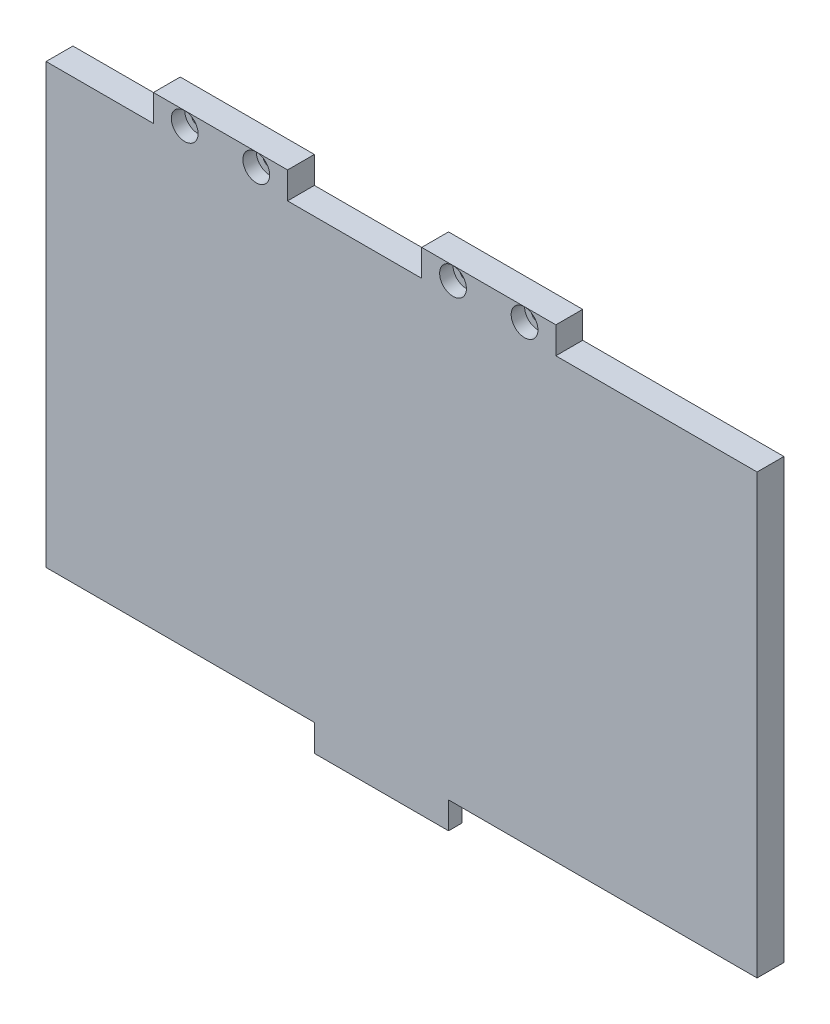
ISO-10303-21;
HEADER;
FILE_DESCRIPTION(('STEP AP214'),'2;1');
FILE_NAME('part.step','',(''),(''),'','','');
FILE_SCHEMA(('AUTOMOTIVE_DESIGN { 1 0 10303 214 1 1 1 1 }'));
ENDSEC;
DATA;
#1=APPLICATION_CONTEXT('core data for automotive mechanical design processes');
#2=APPLICATION_PROTOCOL_DEFINITION('international standard','automotive_design',2000,#1);
#3=PRODUCT_CONTEXT('',#1,'mechanical');
#4=PRODUCT('Part','Part','',(#3));
#5=PRODUCT_RELATED_PRODUCT_CATEGORY('part','',(#4));
#6=PRODUCT_DEFINITION_FORMATION('','',#4);
#7=PRODUCT_DEFINITION_CONTEXT('part definition',#1,'design');
#8=PRODUCT_DEFINITION('design','',#6,#7);
#9=PRODUCT_DEFINITION_SHAPE('','',#8);
#10=(LENGTH_UNIT() NAMED_UNIT(*) SI_UNIT(.MILLI.,.METRE.));
#11=(NAMED_UNIT(*) PLANE_ANGLE_UNIT() SI_UNIT($,.RADIAN.));
#12=(NAMED_UNIT(*) SI_UNIT($,.STERADIAN.) SOLID_ANGLE_UNIT());
#13=UNCERTAINTY_MEASURE_WITH_UNIT(LENGTH_MEASURE(1.E-05),#10,'distance_accuracy_value','');
#14=(GEOMETRIC_REPRESENTATION_CONTEXT(3) GLOBAL_UNCERTAINTY_ASSIGNED_CONTEXT((#13)) GLOBAL_UNIT_ASSIGNED_CONTEXT((#10,
#11,#12)) REPRESENTATION_CONTEXT('',''));
#15=CARTESIAN_POINT('',(0.,0.,0.));
#16=DIRECTION('',(0.,0.,1.));
#17=DIRECTION('',(1.,0.,0.));
#18=AXIS2_PLACEMENT_3D('',#15,#16,#17);
#19=CARTESIAN_POINT('',(-99.,-6.00000000000001,6.));
#20=DIRECTION('',(1.,0.,0.));
#21=DIRECTION('',(0.,1.,0.));
#22=AXIS2_PLACEMENT_3D('',#19,#20,#21);
#23=PLANE('',#22);
#24=DIRECTION('',(0.,1.,0.));
#25=VECTOR('',#24,1.);
#26=CARTESIAN_POINT('',(-99.,0.,3.));
#27=LINE('',#26,#25);
#28=CARTESIAN_POINT('',(-99.,-6.00000000000001,3.));
#29=VERTEX_POINT('',#28);
#30=CARTESIAN_POINT('',(-99.,0.,3.));
#31=VERTEX_POINT('',#30);
#32=EDGE_CURVE('E151',#29,#31,#27,.T.);
#33=ORIENTED_EDGE('',*,*,#32,.F.);
#34=DIRECTION('',(0.,0.,-1.));
#35=VECTOR('',#34,1.);
#36=CARTESIAN_POINT('',(-99.,-6.00000000000001,6.));
#37=LINE('',#36,#35);
#38=CARTESIAN_POINT('',(-99.,-6.00000000000001,6.));
#39=VERTEX_POINT('',#38);
#40=EDGE_CURVE('E159',#39,#29,#37,.T.);
#41=ORIENTED_EDGE('',*,*,#40,.F.);
#42=DIRECTION('',(0.,1.,0.));
#43=VECTOR('',#42,1.);
#44=CARTESIAN_POINT('',(-99.,-6.00000000000001,6.));
#45=LINE('',#44,#43);
#46=CARTESIAN_POINT('',(-98.9999999999999,0.,6.));
#47=VERTEX_POINT('',#46);
#48=EDGE_CURVE('E172',#39,#47,#45,.T.);
#49=ORIENTED_EDGE('',*,*,#48,.T.);
#50=DIRECTION('',(0.,0.,-1.));
#51=VECTOR('',#50,1.);
#52=CARTESIAN_POINT('',(-99.,0.,6.));
#53=LINE('',#52,#51);
#54=EDGE_CURVE('E59',#47,#31,#53,.T.);
#55=ORIENTED_EDGE('',*,*,#54,.T.);
#56=EDGE_LOOP('',(#33,#41,#49,#55));
#57=FACE_BOUND('',#56,.T.);
#58=ADVANCED_FACE('F33',(#57),#23,.F.);
#59=CARTESIAN_POINT('',(-69.,-6.00000000000001,6.));
#60=DIRECTION('',(-1.,0.,0.));
#61=DIRECTION('',(0.,-1.,0.));
#62=AXIS2_PLACEMENT_3D('',#59,#60,#61);
#63=PLANE('',#62);
#64=DIRECTION('',(0.,-1.,0.));
#65=VECTOR('',#64,1.);
#66=CARTESIAN_POINT('',(-68.9999999999999,0.,3.));
#67=LINE('',#66,#65);
#68=CARTESIAN_POINT('',(-68.9999999999999,0.,3.));
#69=VERTEX_POINT('',#68);
#70=CARTESIAN_POINT('',(-69.,-6.00000000000001,3.));
#71=VERTEX_POINT('',#70);
#72=EDGE_CURVE('E51',#69,#71,#67,.T.);
#73=ORIENTED_EDGE('',*,*,#72,.F.);
#74=DIRECTION('',(0.,0.,1.));
#75=VECTOR('',#74,1.);
#76=CARTESIAN_POINT('',(-69.,0.,6.));
#77=LINE('',#76,#75);
#78=CARTESIAN_POINT('',(-69.,0.,6.));
#79=VERTEX_POINT('',#78);
#80=EDGE_CURVE('E37',#69,#79,#77,.T.);
#81=ORIENTED_EDGE('',*,*,#80,.T.);
#82=DIRECTION('',(0.,1.,0.));
#83=VECTOR('',#82,1.);
#84=CARTESIAN_POINT('',(-69.,-6.00000000000001,6.));
#85=LINE('',#84,#83);
#86=CARTESIAN_POINT('',(-69.,-6.00000000000001,6.));
#87=VERTEX_POINT('',#86);
#88=EDGE_CURVE('E181',#87,#79,#85,.T.);
#89=ORIENTED_EDGE('',*,*,#88,.F.);
#90=DIRECTION('',(0.,0.,1.));
#91=VECTOR('',#90,1.);
#92=CARTESIAN_POINT('',(-69.,-6.00000000000001,6.));
#93=LINE('',#92,#91);
#94=EDGE_CURVE('E166',#71,#87,#93,.T.);
#95=ORIENTED_EDGE('',*,*,#94,.F.);
#96=EDGE_LOOP('',(#73,#81,#89,#95));
#97=FACE_BOUND('',#96,.T.);
#98=ADVANCED_FACE('F368',(#97),#63,.F.);
#99=CARTESIAN_POINT('',(0.,-6.,0.));
#100=DIRECTION('',(0.,-1.,0.));
#101=DIRECTION('',(1.,0.,0.));
#102=AXIS2_PLACEMENT_3D('',#99,#100,#101);
#103=PLANE('',#102);
#104=ORIENTED_EDGE('',*,*,#40,.T.);
#105=DIRECTION('',(-1.,0.,0.));
#106=VECTOR('',#105,1.);
#107=CARTESIAN_POINT('',(-68.9999999999999,-6.00000000000001,3.));
#108=LINE('',#107,#106);
#109=EDGE_CURVE('E148',#71,#29,#108,.T.);
#110=ORIENTED_EDGE('',*,*,#109,.F.);
#111=ORIENTED_EDGE('',*,*,#94,.T.);
#112=DIRECTION('',(-1.,0.,0.));
#113=VECTOR('',#112,1.);
#114=CARTESIAN_POINT('',(-99.,-6.00000000000001,6.));
#115=LINE('',#114,#113);
#116=EDGE_CURVE('E164',#87,#39,#115,.T.);
#117=ORIENTED_EDGE('',*,*,#116,.T.);
#118=EDGE_LOOP('',(#104,#110,#111,#117));
#119=FACE_BOUND('',#118,.T.);
#120=ADVANCED_FACE('F162',(#119),#103,.T.);
#121=CARTESIAN_POINT('',(0.,0.,6.));
#122=DIRECTION('',(0.,1.,0.));
#123=DIRECTION('',(-1.,0.,0.));
#124=AXIS2_PLACEMENT_3D('',#121,#122,#123);
#125=PLANE('',#124);
#126=ORIENTED_EDGE('',*,*,#80,.F.);
#127=DIRECTION('',(1.,0.,0.));
#128=VECTOR('',#127,1.);
#129=CARTESIAN_POINT('',(-68.9999999999999,0.,3.));
#130=LINE('',#129,#128);
#131=EDGE_CURVE('E160',#31,#69,#130,.T.);
#132=ORIENTED_EDGE('',*,*,#131,.F.);
#133=ORIENTED_EDGE('',*,*,#54,.F.);
#134=DIRECTION('',(1.,0.,0.));
#135=VECTOR('',#134,1.);
#136=CARTESIAN_POINT('',(0.,0.,6.));
#137=LINE('',#136,#135);
#138=CARTESIAN_POINT('',(-159.,0.,6.));
#139=VERTEX_POINT('',#138);
#140=EDGE_CURVE('E194',#139,#47,#137,.T.);
#141=ORIENTED_EDGE('',*,*,#140,.F.);
#142=DIRECTION('',(0.,0.,-1.));
#143=VECTOR('',#142,1.);
#144=CARTESIAN_POINT('',(-159.,0.,6.));
#145=LINE('',#144,#143);
#146=CARTESIAN_POINT('',(-159.,0.,0.));
#147=VERTEX_POINT('',#146);
#148=EDGE_CURVE('E11',#139,#147,#145,.T.);
#149=ORIENTED_EDGE('',*,*,#148,.T.);
#150=DIRECTION('',(1.,0.,0.));
#151=VECTOR('',#150,1.);
#152=CARTESIAN_POINT('',(0.,0.,0.));
#153=LINE('',#152,#151);
#154=CARTESIAN_POINT('',(0.,0.,0.));
#155=VERTEX_POINT('',#154);
#156=EDGE_CURVE('E212',#147,#155,#153,.T.);
#157=ORIENTED_EDGE('',*,*,#156,.T.);
#158=DIRECTION('',(0.,0.,-1.));
#159=VECTOR('',#158,1.);
#160=CARTESIAN_POINT('',(0.,0.,6.));
#161=LINE('',#160,#159);
#162=CARTESIAN_POINT('',(0.,0.,6.));
#163=VERTEX_POINT('',#162);
#164=EDGE_CURVE('E43',#163,#155,#161,.T.);
#165=ORIENTED_EDGE('',*,*,#164,.F.);
#166=EDGE_CURVE('E191',#79,#163,#137,.T.);
#167=ORIENTED_EDGE('',*,*,#166,.F.);
#168=EDGE_LOOP('',(#126,#132,#133,#141,#149,#157,#165,#167));
#169=FACE_BOUND('',#168,.T.);
#170=ADVANCED_FACE('F353',(#169),#125,.F.);
#171=CARTESIAN_POINT('',(-52.,101.,0.));
#172=DIRECTION('',(0.,0.,1.));
#173=DIRECTION('',(1.,0.,0.));
#174=AXIS2_PLACEMENT_3D('',#171,#172,#173);
#175=CYLINDRICAL_SURFACE('',#174,1.5);
#176=CARTESIAN_POINT('',(-52.,101.,0.));
#177=DIRECTION('',(0.,0.,1.));
#178=DIRECTION('',(1.,0.,0.));
#179=AXIS2_PLACEMENT_3D('',#176,#177,#178);
#180=CIRCLE('',#179,1.5);
#181=CARTESIAN_POINT('',(-50.5,101.,0.));
#182=VERTEX_POINT('',#181);
#183=EDGE_CURVE('E233',#182,#182,#180,.T.);
#184=ORIENTED_EDGE('',*,*,#183,.F.);
#185=EDGE_LOOP('',(#184));
#186=FACE_BOUND('',#185,.T.);
#187=CARTESIAN_POINT('',(-52.,101.,3.));
#188=DIRECTION('',(0.,0.,1.));
#189=DIRECTION('',(1.,0.,0.));
#190=AXIS2_PLACEMENT_3D('',#187,#188,#189);
#191=CIRCLE('',#190,1.5);
#192=CARTESIAN_POINT('',(-50.5,101.,3.));
#193=VERTEX_POINT('',#192);
#194=EDGE_CURVE('E217',#193,#193,#191,.F.);
#195=ORIENTED_EDGE('',*,*,#194,.F.);
#196=EDGE_LOOP('',(#195));
#197=FACE_BOUND('',#196,.T.);
#198=ADVANCED_FACE('F412',(#186,#197),#175,.F.);
#199=CARTESIAN_POINT('',(-68.,101.,0.));
#200=DIRECTION('',(0.,0.,1.));
#201=DIRECTION('',(1.,0.,0.));
#202=AXIS2_PLACEMENT_3D('',#199,#200,#201);
#203=CYLINDRICAL_SURFACE('',#202,1.5);
#204=CARTESIAN_POINT('',(-68.,101.,0.));
#205=DIRECTION('',(0.,0.,1.));
#206=DIRECTION('',(1.,0.,0.));
#207=AXIS2_PLACEMENT_3D('',#204,#205,#206);
#208=CIRCLE('',#207,1.5);
#209=CARTESIAN_POINT('',(-66.5,101.,0.));
#210=VERTEX_POINT('',#209);
#211=EDGE_CURVE('E238',#210,#210,#208,.T.);
#212=ORIENTED_EDGE('',*,*,#211,.F.);
#213=EDGE_LOOP('',(#212));
#214=FACE_BOUND('',#213,.T.);
#215=CARTESIAN_POINT('',(-68.,101.,3.));
#216=DIRECTION('',(0.,0.,1.));
#217=DIRECTION('',(1.,0.,0.));
#218=AXIS2_PLACEMENT_3D('',#215,#216,#217);
#219=CIRCLE('',#218,1.5);
#220=CARTESIAN_POINT('',(-66.5,101.,3.));
#221=VERTEX_POINT('',#220);
#222=EDGE_CURVE('E221',#221,#221,#219,.F.);
#223=ORIENTED_EDGE('',*,*,#222,.F.);
#224=EDGE_LOOP('',(#223));
#225=FACE_BOUND('',#224,.T.);
#226=ADVANCED_FACE('F415',(#214,#225),#203,.F.);
#227=CARTESIAN_POINT('',(-112.,101.,0.));
#228=DIRECTION('',(0.,0.,1.));
#229=DIRECTION('',(1.,0.,0.));
#230=AXIS2_PLACEMENT_3D('',#227,#228,#229);
#231=CYLINDRICAL_SURFACE('',#230,1.5);
#232=CARTESIAN_POINT('',(-112.,101.,0.));
#233=DIRECTION('',(0.,0.,1.));
#234=DIRECTION('',(1.,0.,0.));
#235=AXIS2_PLACEMENT_3D('',#232,#233,#234);
#236=CIRCLE('',#235,1.5);
#237=CARTESIAN_POINT('',(-110.5,101.,0.));
#238=VERTEX_POINT('',#237);
#239=EDGE_CURVE('E251',#238,#238,#236,.T.);
#240=ORIENTED_EDGE('',*,*,#239,.F.);
#241=EDGE_LOOP('',(#240));
#242=FACE_BOUND('',#241,.T.);
#243=CARTESIAN_POINT('',(-112.,101.,3.));
#244=DIRECTION('',(0.,0.,1.));
#245=DIRECTION('',(1.,0.,0.));
#246=AXIS2_PLACEMENT_3D('',#243,#244,#245);
#247=CIRCLE('',#246,1.5);
#248=CARTESIAN_POINT('',(-110.5,101.,3.));
#249=VERTEX_POINT('',#248);
#250=EDGE_CURVE('E226',#249,#249,#247,.F.);
#251=ORIENTED_EDGE('',*,*,#250,.F.);
#252=EDGE_LOOP('',(#251));
#253=FACE_BOUND('',#252,.T.);
#254=ADVANCED_FACE('F419',(#242,#253),#231,.F.);
#255=CARTESIAN_POINT('',(-128.,101.,0.));
#256=DIRECTION('',(0.,0.,1.));
#257=DIRECTION('',(1.,0.,0.));
#258=AXIS2_PLACEMENT_3D('',#255,#256,#257);
#259=CYLINDRICAL_SURFACE('',#258,1.5);
#260=CARTESIAN_POINT('',(-128.,101.,0.));
#261=DIRECTION('',(0.,0.,1.));
#262=DIRECTION('',(1.,0.,0.));
#263=AXIS2_PLACEMENT_3D('',#260,#261,#262);
#264=CIRCLE('',#263,1.5);
#265=CARTESIAN_POINT('',(-126.5,101.,0.));
#266=VERTEX_POINT('',#265);
#267=EDGE_CURVE('E254',#266,#266,#264,.T.);
#268=ORIENTED_EDGE('',*,*,#267,.F.);
#269=EDGE_LOOP('',(#268));
#270=FACE_BOUND('',#269,.T.);
#271=CARTESIAN_POINT('',(-128.,101.,3.));
#272=DIRECTION('',(0.,0.,1.));
#273=DIRECTION('',(1.,0.,0.));
#274=AXIS2_PLACEMENT_3D('',#271,#272,#273);
#275=CIRCLE('',#274,1.5);
#276=CARTESIAN_POINT('',(-126.5,101.,3.));
#277=VERTEX_POINT('',#276);
#278=EDGE_CURVE('E231',#277,#277,#275,.F.);
#279=ORIENTED_EDGE('',*,*,#278,.F.);
#280=EDGE_LOOP('',(#279));
#281=FACE_BOUND('',#280,.T.);
#282=ADVANCED_FACE('F423',(#270,#281),#259,.F.);
#283=CARTESIAN_POINT('',(0.,104.,6.));
#284=DIRECTION('',(0.,-1.,0.));
#285=DIRECTION('',(1.,0.,0.));
#286=AXIS2_PLACEMENT_3D('',#283,#284,#285);
#287=PLANE('',#286);
#288=DIRECTION('',(-1.,0.,0.));
#289=VECTOR('',#288,1.);
#290=CARTESIAN_POINT('',(0.,104.,6.));
#291=LINE('',#290,#289);
#292=CARTESIAN_POINT('',(-105.,104.,6.));
#293=VERTEX_POINT('',#292);
#294=CARTESIAN_POINT('',(-135.,104.,6.));
#295=VERTEX_POINT('',#294);
#296=EDGE_CURVE('E320',#293,#295,#291,.T.);
#297=ORIENTED_EDGE('',*,*,#296,.F.);
#298=DIRECTION('',(0.,0.,1.));
#299=VECTOR('',#298,1.);
#300=CARTESIAN_POINT('',(-105.,104.,0.));
#301=LINE('',#300,#299);
#302=CARTESIAN_POINT('',(-105.,104.,0.));
#303=VERTEX_POINT('',#302);
#304=EDGE_CURVE('E275',#303,#293,#301,.T.);
#305=ORIENTED_EDGE('',*,*,#304,.F.);
#306=DIRECTION('',(-1.,0.,0.));
#307=VECTOR('',#306,1.);
#308=CARTESIAN_POINT('',(0.,104.,0.));
#309=LINE('',#308,#307);
#310=CARTESIAN_POINT('',(-135.,104.,0.));
#311=VERTEX_POINT('',#310);
#312=EDGE_CURVE('E205',#303,#311,#309,.T.);
#313=ORIENTED_EDGE('',*,*,#312,.T.);
#314=DIRECTION('',(0.,0.,1.));
#315=VECTOR('',#314,1.);
#316=CARTESIAN_POINT('',(-135.,104.,0.));
#317=LINE('',#316,#315);
#318=EDGE_CURVE('E206',#311,#295,#317,.T.);
#319=ORIENTED_EDGE('',*,*,#318,.T.);
#320=EDGE_LOOP('',(#297,#305,#313,#319));
#321=FACE_BOUND('',#320,.T.);
#322=ADVANCED_FACE('F338',(#321),#287,.F.);
#323=CARTESIAN_POINT('',(0.,0.,6.));
#324=DIRECTION('',(-1.,0.,0.));
#325=DIRECTION('',(0.,0.,1.));
#326=AXIS2_PLACEMENT_3D('',#323,#324,#325);
#327=PLANE('',#326);
#328=DIRECTION('',(0.,1.,0.));
#329=VECTOR('',#328,1.);
#330=CARTESIAN_POINT('',(0.,0.,0.));
#331=LINE('',#330,#329);
#332=CARTESIAN_POINT('',(0.,98.,0.));
#333=VERTEX_POINT('',#332);
#334=EDGE_CURVE('E201',#155,#333,#331,.T.);
#335=ORIENTED_EDGE('',*,*,#334,.T.);
#336=DIRECTION('',(0.,0.,1.));
#337=VECTOR('',#336,1.);
#338=CARTESIAN_POINT('',(0.,98.,0.));
#339=LINE('',#338,#337);
#340=CARTESIAN_POINT('',(0.,98.,6.));
#341=VERTEX_POINT('',#340);
#342=EDGE_CURVE('E295',#333,#341,#339,.T.);
#343=ORIENTED_EDGE('',*,*,#342,.T.);
#344=DIRECTION('',(0.,1.,0.));
#345=VECTOR('',#344,1.);
#346=CARTESIAN_POINT('',(0.,0.,6.));
#347=LINE('',#346,#345);
#348=EDGE_CURVE('E216',#163,#341,#347,.T.);
#349=ORIENTED_EDGE('',*,*,#348,.F.);
#350=ORIENTED_EDGE('',*,*,#164,.T.);
#351=EDGE_LOOP('',(#335,#343,#349,#350));
#352=FACE_BOUND('',#351,.T.);
#353=ADVANCED_FACE('F35',(#352),#327,.F.);
#354=CARTESIAN_POINT('',(-45.,104.,0.));
#355=VERTEX_POINT('',#354);
#356=CARTESIAN_POINT('',(-75.,104.,0.));
#357=VERTEX_POINT('',#356);
#358=EDGE_CURVE('E207',#355,#357,#309,.T.);
#359=ORIENTED_EDGE('',*,*,#358,.T.);
#360=DIRECTION('',(0.,0.,1.));
#361=VECTOR('',#360,1.);
#362=CARTESIAN_POINT('',(-75.,104.,0.));
#363=LINE('',#362,#361);
#364=CARTESIAN_POINT('',(-75.,104.,6.));
#365=VERTEX_POINT('',#364);
#366=EDGE_CURVE('E278',#357,#365,#363,.T.);
#367=ORIENTED_EDGE('',*,*,#366,.T.);
#368=CARTESIAN_POINT('',(-45.,104.,6.));
#369=VERTEX_POINT('',#368);
#370=EDGE_CURVE('E321',#369,#365,#291,.T.);
#371=ORIENTED_EDGE('',*,*,#370,.F.);
#372=DIRECTION('',(0.,0.,1.));
#373=VECTOR('',#372,1.);
#374=CARTESIAN_POINT('',(-45.,104.,0.));
#375=LINE('',#374,#373);
#376=EDGE_CURVE('E291',#355,#369,#375,.T.);
#377=ORIENTED_EDGE('',*,*,#376,.F.);
#378=EDGE_LOOP('',(#359,#367,#371,#377));
#379=FACE_BOUND('',#378,.T.);
#380=ADVANCED_FACE('F456',(#379),#287,.F.);
#381=CARTESIAN_POINT('',(-159.,0.,6.));
#382=DIRECTION('',(1.,0.,0.));
#383=DIRECTION('',(0.,0.,-1.));
#384=AXIS2_PLACEMENT_3D('',#381,#382,#383);
#385=PLANE('',#384);
#386=DIRECTION('',(0.,-1.,0.));
#387=VECTOR('',#386,1.);
#388=CARTESIAN_POINT('',(-159.,0.,6.));
#389=LINE('',#388,#387);
#390=CARTESIAN_POINT('',(-159.,98.,6.));
#391=VERTEX_POINT('',#390);
#392=EDGE_CURVE('E195',#391,#139,#389,.T.);
#393=ORIENTED_EDGE('',*,*,#392,.F.);
#394=DIRECTION('',(0.,0.,1.));
#395=VECTOR('',#394,1.);
#396=CARTESIAN_POINT('',(-159.,98.,0.));
#397=LINE('',#396,#395);
#398=CARTESIAN_POINT('',(-159.,98.,0.));
#399=VERTEX_POINT('',#398);
#400=EDGE_CURVE('E309',#399,#391,#397,.T.);
#401=ORIENTED_EDGE('',*,*,#400,.F.);
#402=DIRECTION('',(0.,-1.,0.));
#403=VECTOR('',#402,1.);
#404=CARTESIAN_POINT('',(-159.,0.,0.));
#405=LINE('',#404,#403);
#406=EDGE_CURVE('E210',#399,#147,#405,.T.);
#407=ORIENTED_EDGE('',*,*,#406,.T.);
#408=ORIENTED_EDGE('',*,*,#148,.F.);
#409=EDGE_LOOP('',(#393,#401,#407,#408));
#410=FACE_BOUND('',#409,.T.);
#411=ADVANCED_FACE('F350',(#410),#385,.F.);
#412=CARTESIAN_POINT('',(0.,0.,6.));
#413=DIRECTION('',(0.,0.,1.));
#414=DIRECTION('',(1.,0.,0.));
#415=AXIS2_PLACEMENT_3D('',#412,#413,#414);
#416=PLANE('',#415);
#417=CARTESIAN_POINT('',(-52.,101.,6.));
#418=DIRECTION('',(0.,0.,1.));
#419=DIRECTION('',(1.,0.,0.));
#420=AXIS2_PLACEMENT_3D('',#417,#418,#419);
#421=CIRCLE('',#420,2.99499999999999);
#422=CARTESIAN_POINT('',(-49.005,101.,6.));
#423=VERTEX_POINT('',#422);
#424=EDGE_CURVE('E184',#423,#423,#421,.T.);
#425=ORIENTED_EDGE('',*,*,#424,.F.);
#426=EDGE_LOOP('',(#425));
#427=FACE_BOUND('',#426,.T.);
#428=CARTESIAN_POINT('',(-68.,101.,6.));
#429=DIRECTION('',(0.,0.,1.));
#430=DIRECTION('',(1.,0.,0.));
#431=AXIS2_PLACEMENT_3D('',#428,#429,#430);
#432=CIRCLE('',#431,2.995);
#433=CARTESIAN_POINT('',(-65.005,101.,6.));
#434=VERTEX_POINT('',#433);
#435=EDGE_CURVE('E220',#434,#434,#432,.T.);
#436=ORIENTED_EDGE('',*,*,#435,.F.);
#437=EDGE_LOOP('',(#436));
#438=FACE_BOUND('',#437,.T.);
#439=CARTESIAN_POINT('',(-112.,101.,6.));
#440=DIRECTION('',(0.,0.,1.));
#441=DIRECTION('',(1.,0.,0.));
#442=AXIS2_PLACEMENT_3D('',#439,#440,#441);
#443=CIRCLE('',#442,2.995);
#444=CARTESIAN_POINT('',(-109.005,101.,6.));
#445=VERTEX_POINT('',#444);
#446=EDGE_CURVE('E224',#445,#445,#443,.T.);
#447=ORIENTED_EDGE('',*,*,#446,.F.);
#448=EDGE_LOOP('',(#447));
#449=FACE_BOUND('',#448,.T.);
#450=CARTESIAN_POINT('',(-128.,101.,6.));
#451=DIRECTION('',(0.,0.,1.));
#452=DIRECTION('',(1.,0.,0.));
#453=AXIS2_PLACEMENT_3D('',#450,#451,#452);
#454=CIRCLE('',#453,2.995);
#455=CARTESIAN_POINT('',(-125.005,101.,6.));
#456=VERTEX_POINT('',#455);
#457=EDGE_CURVE('E229',#456,#456,#454,.T.);
#458=ORIENTED_EDGE('',*,*,#457,.F.);
#459=EDGE_LOOP('',(#458));
#460=FACE_BOUND('',#459,.T.);
#461=DIRECTION('',(0.,-1.,0.));
#462=VECTOR('',#461,1.);
#463=CARTESIAN_POINT('',(-105.,104.,6.));
#464=LINE('',#463,#462);
#465=CARTESIAN_POINT('',(-105.,98.,6.));
#466=VERTEX_POINT('',#465);
#467=EDGE_CURVE('E257',#293,#466,#464,.T.);
#468=ORIENTED_EDGE('',*,*,#467,.F.);
#469=ORIENTED_EDGE('',*,*,#296,.T.);
#470=DIRECTION('',(0.,1.,0.));
#471=VECTOR('',#470,1.);
#472=CARTESIAN_POINT('',(-135.,104.,6.));
#473=LINE('',#472,#471);
#474=CARTESIAN_POINT('',(-135.,98.,6.));
#475=VERTEX_POINT('',#474);
#476=EDGE_CURVE('E306',#475,#295,#473,.T.);
#477=ORIENTED_EDGE('',*,*,#476,.F.);
#478=DIRECTION('',(1.,0.,0.));
#479=VECTOR('',#478,1.);
#480=CARTESIAN_POINT('',(-159.,98.,6.));
#481=LINE('',#480,#479);
#482=EDGE_CURVE('E298',#391,#475,#481,.T.);
#483=ORIENTED_EDGE('',*,*,#482,.F.);
#484=ORIENTED_EDGE('',*,*,#392,.T.);
#485=ORIENTED_EDGE('',*,*,#140,.T.);
#486=ORIENTED_EDGE('',*,*,#48,.F.);
#487=ORIENTED_EDGE('',*,*,#116,.F.);
#488=ORIENTED_EDGE('',*,*,#88,.T.);
#489=ORIENTED_EDGE('',*,*,#166,.T.);
#490=ORIENTED_EDGE('',*,*,#348,.T.);
#491=DIRECTION('',(1.,0.,0.));
#492=VECTOR('',#491,1.);
#493=CARTESIAN_POINT('',(0.,98.,6.));
#494=LINE('',#493,#492);
#495=CARTESIAN_POINT('',(-45.,98.,6.));
#496=VERTEX_POINT('',#495);
#497=EDGE_CURVE('E288',#496,#341,#494,.T.);
#498=ORIENTED_EDGE('',*,*,#497,.F.);
#499=DIRECTION('',(0.,-1.,0.));
#500=VECTOR('',#499,1.);
#501=CARTESIAN_POINT('',(-45.,104.,6.));
#502=LINE('',#501,#500);
#503=EDGE_CURVE('E277',#369,#496,#502,.T.);
#504=ORIENTED_EDGE('',*,*,#503,.F.);
#505=ORIENTED_EDGE('',*,*,#370,.T.);
#506=DIRECTION('',(0.,1.,0.));
#507=VECTOR('',#506,1.);
#508=CARTESIAN_POINT('',(-75.,104.,6.));
#509=LINE('',#508,#507);
#510=CARTESIAN_POINT('',(-75.,98.,6.));
#511=VERTEX_POINT('',#510);
#512=EDGE_CURVE('E262',#511,#365,#509,.T.);
#513=ORIENTED_EDGE('',*,*,#512,.F.);
#514=DIRECTION('',(1.,0.,0.));
#515=VECTOR('',#514,1.);
#516=CARTESIAN_POINT('',(-105.,98.,6.));
#517=LINE('',#516,#515);
#518=EDGE_CURVE('E271',#466,#511,#517,.T.);
#519=ORIENTED_EDGE('',*,*,#518,.F.);
#520=EDGE_LOOP('',(#468,#469,#477,#483,#484,#485,#486,#487,#488,#489,#490,#498,#504,#505,#513,#519));
#521=FACE_BOUND('',#520,.T.);
#522=ADVANCED_FACE('F329',(#427,#438,#449,#460,#521),#416,.T.);
#523=CARTESIAN_POINT('',(0.,0.,0.));
#524=DIRECTION('',(0.,0.,1.));
#525=DIRECTION('',(1.,0.,0.));
#526=AXIS2_PLACEMENT_3D('',#523,#524,#525);
#527=PLANE('',#526);
#528=ORIENTED_EDGE('',*,*,#183,.T.);
#529=EDGE_LOOP('',(#528));
#530=FACE_BOUND('',#529,.T.);
#531=ORIENTED_EDGE('',*,*,#211,.T.);
#532=EDGE_LOOP('',(#531));
#533=FACE_BOUND('',#532,.T.);
#534=ORIENTED_EDGE('',*,*,#239,.T.);
#535=EDGE_LOOP('',(#534));
#536=FACE_BOUND('',#535,.T.);
#537=ORIENTED_EDGE('',*,*,#267,.T.);
#538=EDGE_LOOP('',(#537));
#539=FACE_BOUND('',#538,.T.);
#540=ORIENTED_EDGE('',*,*,#334,.F.);
#541=ORIENTED_EDGE('',*,*,#156,.F.);
#542=ORIENTED_EDGE('',*,*,#406,.F.);
#543=DIRECTION('',(1.,0.,0.));
#544=VECTOR('',#543,1.);
#545=CARTESIAN_POINT('',(-159.,98.,0.));
#546=LINE('',#545,#544);
#547=CARTESIAN_POINT('',(-135.,98.,0.));
#548=VERTEX_POINT('',#547);
#549=EDGE_CURVE('E302',#399,#548,#546,.T.);
#550=ORIENTED_EDGE('',*,*,#549,.T.);
#551=DIRECTION('',(0.,1.,0.));
#552=VECTOR('',#551,1.);
#553=CARTESIAN_POINT('',(-135.,104.,0.));
#554=LINE('',#553,#552);
#555=EDGE_CURVE('E305',#548,#311,#554,.T.);
#556=ORIENTED_EDGE('',*,*,#555,.T.);
#557=ORIENTED_EDGE('',*,*,#312,.F.);
#558=DIRECTION('',(0.,-1.,0.));
#559=VECTOR('',#558,1.);
#560=CARTESIAN_POINT('',(-105.,104.,0.));
#561=LINE('',#560,#559);
#562=CARTESIAN_POINT('',(-105.,98.,0.));
#563=VERTEX_POINT('',#562);
#564=EDGE_CURVE('E258',#303,#563,#561,.T.);
#565=ORIENTED_EDGE('',*,*,#564,.T.);
#566=DIRECTION('',(1.,0.,0.));
#567=VECTOR('',#566,1.);
#568=CARTESIAN_POINT('',(-105.,98.,0.));
#569=LINE('',#568,#567);
#570=CARTESIAN_POINT('',(-75.,98.,0.));
#571=VERTEX_POINT('',#570);
#572=EDGE_CURVE('E261',#563,#571,#569,.T.);
#573=ORIENTED_EDGE('',*,*,#572,.T.);
#574=DIRECTION('',(0.,1.,0.));
#575=VECTOR('',#574,1.);
#576=CARTESIAN_POINT('',(-75.,104.,0.));
#577=LINE('',#576,#575);
#578=EDGE_CURVE('E265',#571,#357,#577,.T.);
#579=ORIENTED_EDGE('',*,*,#578,.T.);
#580=ORIENTED_EDGE('',*,*,#358,.F.);
#581=DIRECTION('',(0.,-1.,0.));
#582=VECTOR('',#581,1.);
#583=CARTESIAN_POINT('',(-45.,104.,0.));
#584=LINE('',#583,#582);
#585=CARTESIAN_POINT('',(-45.,98.,0.));
#586=VERTEX_POINT('',#585);
#587=EDGE_CURVE('E284',#355,#586,#584,.T.);
#588=ORIENTED_EDGE('',*,*,#587,.T.);
#589=DIRECTION('',(1.,0.,0.));
#590=VECTOR('',#589,1.);
#591=CARTESIAN_POINT('',(0.,98.,0.));
#592=LINE('',#591,#590);
#593=EDGE_CURVE('E287',#586,#333,#592,.T.);
#594=ORIENTED_EDGE('',*,*,#593,.T.);
#595=EDGE_LOOP('',(#540,#541,#542,#550,#556,#557,#565,#573,#579,#580,#588,#594));
#596=FACE_BOUND('',#595,.T.);
#597=ADVANCED_FACE('F342',(#530,#533,#536,#539,#596),#527,.F.);
#598=CARTESIAN_POINT('',(-135.,104.,0.));
#599=DIRECTION('',(1.,0.,0.));
#600=DIRECTION('',(0.,0.,-1.));
#601=AXIS2_PLACEMENT_3D('',#598,#599,#600);
#602=PLANE('',#601);
#603=ORIENTED_EDGE('',*,*,#476,.T.);
#604=ORIENTED_EDGE('',*,*,#318,.F.);
#605=ORIENTED_EDGE('',*,*,#555,.F.);
#606=DIRECTION('',(0.,0.,1.));
#607=VECTOR('',#606,1.);
#608=CARTESIAN_POINT('',(-135.,98.,0.));
#609=LINE('',#608,#607);
#610=EDGE_CURVE('E316',#548,#475,#609,.T.);
#611=ORIENTED_EDGE('',*,*,#610,.T.);
#612=EDGE_LOOP('',(#603,#604,#605,#611));
#613=FACE_BOUND('',#612,.T.);
#614=ADVANCED_FACE('F336',(#613),#602,.F.);
#615=CARTESIAN_POINT('',(-159.,98.,0.));
#616=DIRECTION('',(0.,-1.,0.));
#617=DIRECTION('',(0.,0.,-1.));
#618=AXIS2_PLACEMENT_3D('',#615,#616,#617);
#619=PLANE('',#618);
#620=ORIENTED_EDGE('',*,*,#482,.T.);
#621=ORIENTED_EDGE('',*,*,#610,.F.);
#622=ORIENTED_EDGE('',*,*,#549,.F.);
#623=ORIENTED_EDGE('',*,*,#400,.T.);
#624=EDGE_LOOP('',(#620,#621,#622,#623));
#625=FACE_BOUND('',#624,.T.);
#626=ADVANCED_FACE('F345',(#625),#619,.F.);
#627=CARTESIAN_POINT('',(0.,98.,0.));
#628=DIRECTION('',(0.,-1.,0.));
#629=DIRECTION('',(0.,0.,-1.));
#630=AXIS2_PLACEMENT_3D('',#627,#628,#629);
#631=PLANE('',#630);
#632=ORIENTED_EDGE('',*,*,#497,.T.);
#633=ORIENTED_EDGE('',*,*,#342,.F.);
#634=ORIENTED_EDGE('',*,*,#593,.F.);
#635=DIRECTION('',(0.,0.,1.));
#636=VECTOR('',#635,1.);
#637=CARTESIAN_POINT('',(-45.,98.,0.));
#638=LINE('',#637,#636);
#639=EDGE_CURVE('E299',#586,#496,#638,.T.);
#640=ORIENTED_EDGE('',*,*,#639,.T.);
#641=EDGE_LOOP('',(#632,#633,#634,#640));
#642=FACE_BOUND('',#641,.T.);
#643=ADVANCED_FACE('F362',(#642),#631,.F.);
#644=CARTESIAN_POINT('',(-45.,104.,0.));
#645=DIRECTION('',(-1.,0.,0.));
#646=DIRECTION('',(0.,0.,1.));
#647=AXIS2_PLACEMENT_3D('',#644,#645,#646);
#648=PLANE('',#647);
#649=ORIENTED_EDGE('',*,*,#503,.T.);
#650=ORIENTED_EDGE('',*,*,#639,.F.);
#651=ORIENTED_EDGE('',*,*,#587,.F.);
#652=ORIENTED_EDGE('',*,*,#376,.T.);
#653=EDGE_LOOP('',(#649,#650,#651,#652));
#654=FACE_BOUND('',#653,.T.);
#655=ADVANCED_FACE('F364',(#654),#648,.F.);
#656=CARTESIAN_POINT('',(-105.,104.,0.));
#657=DIRECTION('',(-1.,0.,0.));
#658=DIRECTION('',(0.,0.,1.));
#659=AXIS2_PLACEMENT_3D('',#656,#657,#658);
#660=PLANE('',#659);
#661=ORIENTED_EDGE('',*,*,#467,.T.);
#662=DIRECTION('',(0.,0.,1.));
#663=VECTOR('',#662,1.);
#664=CARTESIAN_POINT('',(-105.,98.,0.));
#665=LINE('',#664,#663);
#666=EDGE_CURVE('E268',#563,#466,#665,.T.);
#667=ORIENTED_EDGE('',*,*,#666,.F.);
#668=ORIENTED_EDGE('',*,*,#564,.F.);
#669=ORIENTED_EDGE('',*,*,#304,.T.);
#670=EDGE_LOOP('',(#661,#667,#668,#669));
#671=FACE_BOUND('',#670,.T.);
#672=ADVANCED_FACE('F431',(#671),#660,.F.);
#673=CARTESIAN_POINT('',(-75.,104.,0.));
#674=DIRECTION('',(1.,0.,0.));
#675=DIRECTION('',(0.,0.,-1.));
#676=AXIS2_PLACEMENT_3D('',#673,#674,#675);
#677=PLANE('',#676);
#678=ORIENTED_EDGE('',*,*,#512,.T.);
#679=ORIENTED_EDGE('',*,*,#366,.F.);
#680=ORIENTED_EDGE('',*,*,#578,.F.);
#681=DIRECTION('',(0.,0.,1.));
#682=VECTOR('',#681,1.);
#683=CARTESIAN_POINT('',(-75.,98.,0.));
#684=LINE('',#683,#682);
#685=EDGE_CURVE('E281',#571,#511,#684,.T.);
#686=ORIENTED_EDGE('',*,*,#685,.T.);
#687=EDGE_LOOP('',(#678,#679,#680,#686));
#688=FACE_BOUND('',#687,.T.);
#689=ADVANCED_FACE('F428',(#688),#677,.F.);
#690=CARTESIAN_POINT('',(-105.,98.,0.));
#691=DIRECTION('',(0.,-1.,0.));
#692=DIRECTION('',(1.,0.,0.));
#693=AXIS2_PLACEMENT_3D('',#690,#691,#692);
#694=PLANE('',#693);
#695=ORIENTED_EDGE('',*,*,#518,.T.);
#696=ORIENTED_EDGE('',*,*,#685,.F.);
#697=ORIENTED_EDGE('',*,*,#572,.F.);
#698=ORIENTED_EDGE('',*,*,#666,.T.);
#699=EDGE_LOOP('',(#695,#696,#697,#698));
#700=FACE_BOUND('',#699,.T.);
#701=ADVANCED_FACE('F408',(#700),#694,.F.);
#702=CARTESIAN_POINT('',(-128.,101.,3.));
#703=DIRECTION('',(0.,0.,1.));
#704=DIRECTION('',(1.,0.,0.));
#705=AXIS2_PLACEMENT_3D('',#702,#703,#704);
#706=PLANE('',#705);
#707=CARTESIAN_POINT('',(-128.,101.,3.));
#708=DIRECTION('',(0.,0.,1.));
#709=DIRECTION('',(1.,0.,0.));
#710=AXIS2_PLACEMENT_3D('',#707,#708,#709);
#711=CIRCLE('',#710,2.995);
#712=CARTESIAN_POINT('',(-125.005,101.,3.));
#713=VERTEX_POINT('',#712);
#714=EDGE_CURVE('E234',#713,#713,#711,.T.);
#715=ORIENTED_EDGE('',*,*,#714,.T.);
#716=EDGE_LOOP('',(#715));
#717=FACE_BOUND('',#716,.T.);
#718=ORIENTED_EDGE('',*,*,#278,.T.);
#719=EDGE_LOOP('',(#718));
#720=FACE_BOUND('',#719,.T.);
#721=ADVANCED_FACE('F405',(#717,#720),#706,.T.);
#722=CARTESIAN_POINT('',(-128.,101.,3.));
#723=DIRECTION('',(0.,0.,1.));
#724=DIRECTION('',(1.,0.,0.));
#725=AXIS2_PLACEMENT_3D('',#722,#723,#724);
#726=CYLINDRICAL_SURFACE('',#725,2.995);
#727=ORIENTED_EDGE('',*,*,#714,.F.);
#728=EDGE_LOOP('',(#727));
#729=FACE_BOUND('',#728,.T.);
#730=ORIENTED_EDGE('',*,*,#457,.T.);
#731=EDGE_LOOP('',(#730));
#732=FACE_BOUND('',#731,.T.);
#733=ADVANCED_FACE('F400',(#729,#732),#726,.F.);
#734=CARTESIAN_POINT('',(-112.,101.,3.));
#735=DIRECTION('',(0.,0.,1.));
#736=DIRECTION('',(1.,0.,0.));
#737=AXIS2_PLACEMENT_3D('',#734,#735,#736);
#738=PLANE('',#737);
#739=CARTESIAN_POINT('',(-112.,101.,3.));
#740=DIRECTION('',(0.,0.,1.));
#741=DIRECTION('',(1.,0.,0.));
#742=AXIS2_PLACEMENT_3D('',#739,#740,#741);
#743=CIRCLE('',#742,2.995);
#744=CARTESIAN_POINT('',(-109.005,101.,3.));
#745=VERTEX_POINT('',#744);
#746=EDGE_CURVE('E230',#745,#745,#743,.T.);
#747=ORIENTED_EDGE('',*,*,#746,.T.);
#748=EDGE_LOOP('',(#747));
#749=FACE_BOUND('',#748,.T.);
#750=ORIENTED_EDGE('',*,*,#250,.T.);
#751=EDGE_LOOP('',(#750));
#752=FACE_BOUND('',#751,.T.);
#753=ADVANCED_FACE('F397',(#749,#752),#738,.T.);
#754=CARTESIAN_POINT('',(-112.,101.,3.));
#755=DIRECTION('',(0.,0.,1.));
#756=DIRECTION('',(1.,0.,0.));
#757=AXIS2_PLACEMENT_3D('',#754,#755,#756);
#758=CYLINDRICAL_SURFACE('',#757,2.995);
#759=ORIENTED_EDGE('',*,*,#746,.F.);
#760=EDGE_LOOP('',(#759));
#761=FACE_BOUND('',#760,.T.);
#762=ORIENTED_EDGE('',*,*,#446,.T.);
#763=EDGE_LOOP('',(#762));
#764=FACE_BOUND('',#763,.T.);
#765=ADVANCED_FACE('F392',(#761,#764),#758,.F.);
#766=CARTESIAN_POINT('',(-68.,101.,3.));
#767=DIRECTION('',(0.,0.,1.));
#768=DIRECTION('',(1.,0.,0.));
#769=AXIS2_PLACEMENT_3D('',#766,#767,#768);
#770=PLANE('',#769);
#771=CARTESIAN_POINT('',(-68.,101.,3.));
#772=DIRECTION('',(0.,0.,1.));
#773=DIRECTION('',(1.,0.,0.));
#774=AXIS2_PLACEMENT_3D('',#771,#772,#773);
#775=CIRCLE('',#774,2.995);
#776=CARTESIAN_POINT('',(-65.005,101.,3.));
#777=VERTEX_POINT('',#776);
#778=EDGE_CURVE('E225',#777,#777,#775,.T.);
#779=ORIENTED_EDGE('',*,*,#778,.T.);
#780=EDGE_LOOP('',(#779));
#781=FACE_BOUND('',#780,.T.);
#782=ORIENTED_EDGE('',*,*,#222,.T.);
#783=EDGE_LOOP('',(#782));
#784=FACE_BOUND('',#783,.T.);
#785=ADVANCED_FACE('F389',(#781,#784),#770,.T.);
#786=CARTESIAN_POINT('',(-68.,101.,3.));
#787=DIRECTION('',(0.,0.,1.));
#788=DIRECTION('',(1.,0.,0.));
#789=AXIS2_PLACEMENT_3D('',#786,#787,#788);
#790=CYLINDRICAL_SURFACE('',#789,2.995);
#791=ORIENTED_EDGE('',*,*,#778,.F.);
#792=EDGE_LOOP('',(#791));
#793=FACE_BOUND('',#792,.T.);
#794=ORIENTED_EDGE('',*,*,#435,.T.);
#795=EDGE_LOOP('',(#794));
#796=FACE_BOUND('',#795,.T.);
#797=ADVANCED_FACE('F384',(#793,#796),#790,.F.);
#798=CARTESIAN_POINT('',(-52.,101.,3.));
#799=DIRECTION('',(0.,0.,1.));
#800=DIRECTION('',(1.,0.,0.));
#801=AXIS2_PLACEMENT_3D('',#798,#799,#800);
#802=PLANE('',#801);
#803=CARTESIAN_POINT('',(-52.,101.,3.));
#804=DIRECTION('',(0.,0.,1.));
#805=DIRECTION('',(1.,0.,0.));
#806=AXIS2_PLACEMENT_3D('',#803,#804,#805);
#807=CIRCLE('',#806,2.99499999999999);
#808=CARTESIAN_POINT('',(-49.005,101.,3.));
#809=VERTEX_POINT('',#808);
#810=EDGE_CURVE('E188',#809,#809,#807,.T.);
#811=ORIENTED_EDGE('',*,*,#810,.T.);
#812=EDGE_LOOP('',(#811));
#813=FACE_BOUND('',#812,.T.);
#814=ORIENTED_EDGE('',*,*,#194,.T.);
#815=EDGE_LOOP('',(#814));
#816=FACE_BOUND('',#815,.T.);
#817=ADVANCED_FACE('F380',(#813,#816),#802,.T.);
#818=CARTESIAN_POINT('',(-52.,101.,3.));
#819=DIRECTION('',(0.,0.,1.));
#820=DIRECTION('',(1.,0.,0.));
#821=AXIS2_PLACEMENT_3D('',#818,#819,#820);
#822=CYLINDRICAL_SURFACE('',#821,2.99499999999999);
#823=ORIENTED_EDGE('',*,*,#810,.F.);
#824=EDGE_LOOP('',(#823));
#825=FACE_BOUND('',#824,.T.);
#826=ORIENTED_EDGE('',*,*,#424,.T.);
#827=EDGE_LOOP('',(#826));
#828=FACE_BOUND('',#827,.T.);
#829=ADVANCED_FACE('F383',(#825,#828),#822,.F.);
#830=CARTESIAN_POINT('',(0.,0.,3.));
#831=DIRECTION('',(0.,0.,-1.));
#832=DIRECTION('',(-1.,0.,0.));
#833=AXIS2_PLACEMENT_3D('',#830,#831,#832);
#834=PLANE('',#833);
#835=ORIENTED_EDGE('',*,*,#72,.T.);
#836=ORIENTED_EDGE('',*,*,#109,.T.);
#837=ORIENTED_EDGE('',*,*,#32,.T.);
#838=ORIENTED_EDGE('',*,*,#131,.T.);
#839=EDGE_LOOP('',(#835,#836,#837,#838));
#840=FACE_BOUND('',#839,.T.);
#841=ADVANCED_FACE('F150',(#840),#834,.T.);
#842=CLOSED_SHELL('',(#58,#98,#120,#170,#198,#226,#254,#282,#322,#353,#380,#411,#522,#597,#614,
#626,#643,#655,#672,#689,#701,#721,#733,#753,#765,#785,#797,#817,#829,#841));
#843=MANIFOLD_SOLID_BREP('B2',#842);
#844=ADVANCED_BREP_SHAPE_REPRESENTATION('',(#18,#843),#14);
#845=SHAPE_DEFINITION_REPRESENTATION(#9,#844);
ENDSEC;
END-ISO-10303-21;
